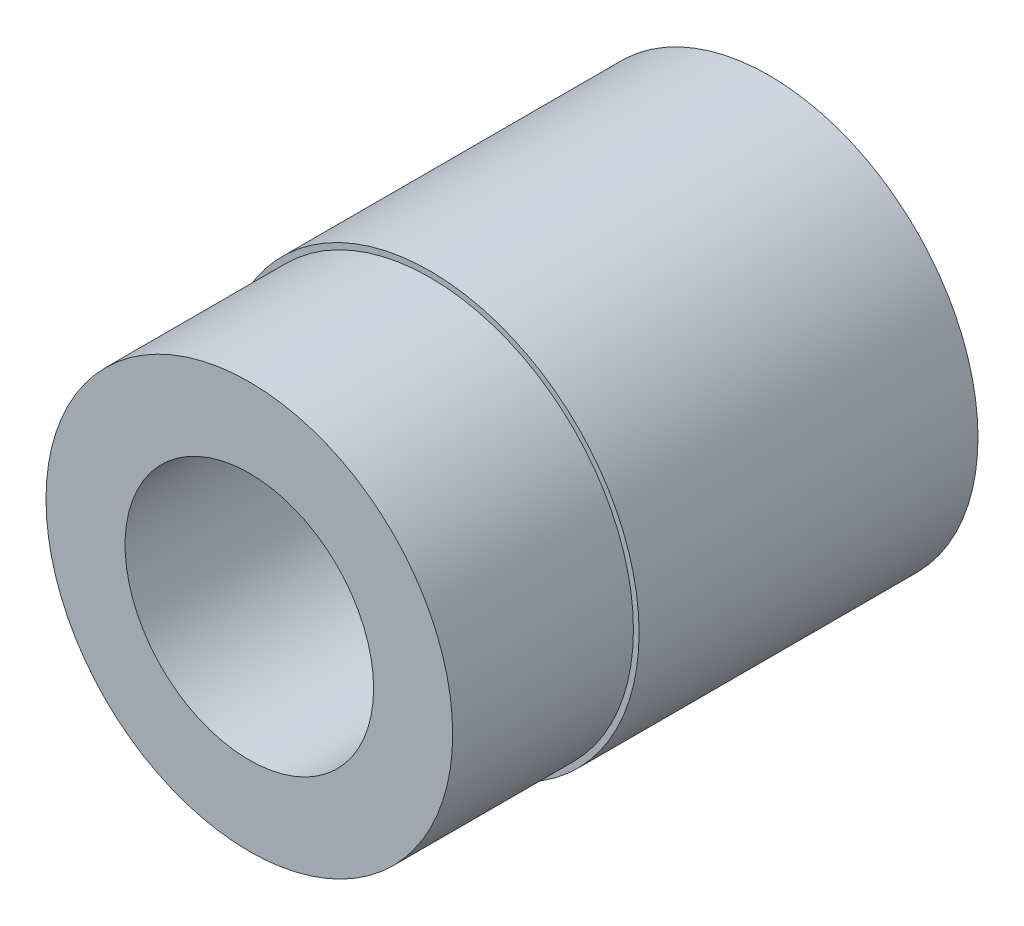
ISO-10303-21;
HEADER;
FILE_DESCRIPTION(('STEP AP214'),'2;1');
FILE_NAME('part.step','',(''),(''),'','','');
FILE_SCHEMA(('AUTOMOTIVE_DESIGN { 1 0 10303 214 1 1 1 1 }'));
ENDSEC;
DATA;
#1=APPLICATION_CONTEXT('core data for automotive mechanical design processes');
#2=APPLICATION_PROTOCOL_DEFINITION('international standard','automotive_design',2000,#1);
#3=PRODUCT_CONTEXT('',#1,'mechanical');
#4=PRODUCT('Part','Part','',(#3));
#5=PRODUCT_RELATED_PRODUCT_CATEGORY('part','',(#4));
#6=PRODUCT_DEFINITION_FORMATION('','',#4);
#7=PRODUCT_DEFINITION_CONTEXT('part definition',#1,'design');
#8=PRODUCT_DEFINITION('design','',#6,#7);
#9=PRODUCT_DEFINITION_SHAPE('','',#8);
#10=(LENGTH_UNIT() NAMED_UNIT(*) SI_UNIT(.MILLI.,.METRE.));
#11=(NAMED_UNIT(*) PLANE_ANGLE_UNIT() SI_UNIT($,.RADIAN.));
#12=(NAMED_UNIT(*) SI_UNIT($,.STERADIAN.) SOLID_ANGLE_UNIT());
#13=UNCERTAINTY_MEASURE_WITH_UNIT(LENGTH_MEASURE(1.E-05),#10,'distance_accuracy_value','');
#14=(GEOMETRIC_REPRESENTATION_CONTEXT(3) GLOBAL_UNCERTAINTY_ASSIGNED_CONTEXT((#13)) GLOBAL_UNIT_ASSIGNED_CONTEXT((#10,
#11,#12)) REPRESENTATION_CONTEXT('',''));
#15=CARTESIAN_POINT('',(0.,0.,0.));
#16=DIRECTION('',(0.,0.,1.));
#17=DIRECTION('',(1.,0.,0.));
#18=AXIS2_PLACEMENT_3D('',#15,#16,#17);
#19=CARTESIAN_POINT('',(0.,0.,30.));
#20=DIRECTION('',(0.,0.,1.));
#21=DIRECTION('',(1.,0.,0.));
#22=AXIS2_PLACEMENT_3D('',#19,#20,#21);
#23=PLANE('',#22);
#24=CARTESIAN_POINT('',(0.,0.,30.));
#25=DIRECTION('',(0.,0.,1.));
#26=DIRECTION('',(1.,0.,0.));
#27=AXIS2_PLACEMENT_3D('',#24,#25,#26);
#28=CIRCLE('',#27,18.5);
#29=CARTESIAN_POINT('',(18.5,0.,30.));
#30=VERTEX_POINT('',#29);
#31=EDGE_CURVE('E10',#30,#30,#28,.T.);
#32=ORIENTED_EDGE('',*,*,#31,.T.);
#33=EDGE_LOOP('',(#32));
#34=FACE_BOUND('',#33,.T.);
#35=CARTESIAN_POINT('',(0.,0.,30.));
#36=DIRECTION('',(0.,0.,1.));
#37=DIRECTION('',(1.,0.,0.));
#38=AXIS2_PLACEMENT_3D('',#35,#36,#37);
#39=CIRCLE('',#38,18.);
#40=CARTESIAN_POINT('',(18.,0.,30.));
#41=VERTEX_POINT('',#40);
#42=EDGE_CURVE('E41',#41,#41,#39,.T.);
#43=ORIENTED_EDGE('',*,*,#42,.F.);
#44=EDGE_LOOP('',(#43));
#45=FACE_BOUND('',#44,.T.);
#46=ADVANCED_FACE('F28',(#34,#45),#23,.T.);
#47=CARTESIAN_POINT('',(0.,0.,30.));
#48=DIRECTION('',(0.,0.,-1.));
#49=DIRECTION('',(-1.,0.,0.));
#50=AXIS2_PLACEMENT_3D('',#47,#48,#49);
#51=CYLINDRICAL_SURFACE('',#50,18.5);
#52=ORIENTED_EDGE('',*,*,#31,.F.);
#53=EDGE_LOOP('',(#52));
#54=FACE_BOUND('',#53,.T.);
#55=CARTESIAN_POINT('',(0.,0.,0.));
#56=DIRECTION('',(0.,0.,1.));
#57=DIRECTION('',(1.,0.,0.));
#58=AXIS2_PLACEMENT_3D('',#55,#56,#57);
#59=CIRCLE('',#58,18.5);
#60=CARTESIAN_POINT('',(18.5,0.,0.));
#61=VERTEX_POINT('',#60);
#62=EDGE_CURVE('E32',#61,#61,#59,.T.);
#63=ORIENTED_EDGE('',*,*,#62,.T.);
#64=EDGE_LOOP('',(#63));
#65=FACE_BOUND('',#64,.T.);
#66=ADVANCED_FACE('F30',(#54,#65),#51,.T.);
#67=CARTESIAN_POINT('',(0.,0.,0.));
#68=DIRECTION('',(0.,0.,1.));
#69=DIRECTION('',(1.,0.,0.));
#70=AXIS2_PLACEMENT_3D('',#67,#68,#69);
#71=PLANE('',#70);
#72=ORIENTED_EDGE('',*,*,#62,.F.);
#73=EDGE_LOOP('',(#72));
#74=FACE_BOUND('',#73,.T.);
#75=ADVANCED_FACE('F70',(#74),#71,.F.);
#76=CARTESIAN_POINT('',(0.,0.,46.));
#77=DIRECTION('',(0.,0.,-1.));
#78=DIRECTION('',(-1.,0.,0.));
#79=AXIS2_PLACEMENT_3D('',#76,#77,#78);
#80=CYLINDRICAL_SURFACE('',#79,18.);
#81=CARTESIAN_POINT('',(0.,0.,46.));
#82=DIRECTION('',(0.,0.,1.));
#83=DIRECTION('',(1.,0.,0.));
#84=AXIS2_PLACEMENT_3D('',#81,#82,#83);
#85=CIRCLE('',#84,18.);
#86=CARTESIAN_POINT('',(18.,0.,46.));
#87=VERTEX_POINT('',#86);
#88=EDGE_CURVE('E39',#87,#87,#85,.T.);
#89=ORIENTED_EDGE('',*,*,#88,.F.);
#90=EDGE_LOOP('',(#89));
#91=FACE_BOUND('',#90,.T.);
#92=ORIENTED_EDGE('',*,*,#42,.T.);
#93=EDGE_LOOP('',(#92));
#94=FACE_BOUND('',#93,.T.);
#95=ADVANCED_FACE('F64',(#91,#94),#80,.T.);
#96=CARTESIAN_POINT('',(0.,0.,46.));
#97=DIRECTION('',(0.,0.,1.));
#98=DIRECTION('',(1.,0.,0.));
#99=AXIS2_PLACEMENT_3D('',#96,#97,#98);
#100=PLANE('',#99);
#101=CARTESIAN_POINT('',(0.,0.,46.));
#102=DIRECTION('',(0.,0.,1.));
#103=DIRECTION('',(1.,0.,0.));
#104=AXIS2_PLACEMENT_3D('',#101,#102,#103);
#105=CIRCLE('',#104,11.);
#106=CARTESIAN_POINT('',(11.,0.,46.));
#107=VERTEX_POINT('',#106);
#108=EDGE_CURVE('E47',#107,#107,#105,.T.);
#109=ORIENTED_EDGE('',*,*,#108,.F.);
#110=EDGE_LOOP('',(#109));
#111=FACE_BOUND('',#110,.T.);
#112=ORIENTED_EDGE('',*,*,#88,.T.);
#113=EDGE_LOOP('',(#112));
#114=FACE_BOUND('',#113,.T.);
#115=ADVANCED_FACE('F58',(#111,#114),#100,.T.);
#116=CARTESIAN_POINT('',(0.,0.,16.));
#117=DIRECTION('',(0.,0.,1.));
#118=DIRECTION('',(1.,0.,0.));
#119=AXIS2_PLACEMENT_3D('',#116,#117,#118);
#120=CYLINDRICAL_SURFACE('',#119,11.);
#121=CARTESIAN_POINT('',(0.,0.,16.));
#122=DIRECTION('',(0.,0.,1.));
#123=DIRECTION('',(1.,0.,0.));
#124=AXIS2_PLACEMENT_3D('',#121,#122,#123);
#125=CIRCLE('',#124,11.);
#126=CARTESIAN_POINT('',(11.,0.,16.));
#127=VERTEX_POINT('',#126);
#128=EDGE_CURVE('E44',#127,#127,#125,.T.);
#129=ORIENTED_EDGE('',*,*,#128,.F.);
#130=EDGE_LOOP('',(#129));
#131=FACE_BOUND('',#130,.T.);
#132=ORIENTED_EDGE('',*,*,#108,.T.);
#133=EDGE_LOOP('',(#132));
#134=FACE_BOUND('',#133,.T.);
#135=ADVANCED_FACE('F55',(#131,#134),#120,.F.);
#136=CARTESIAN_POINT('',(0.,0.,16.));
#137=DIRECTION('',(0.,0.,1.));
#138=DIRECTION('',(1.,0.,0.));
#139=AXIS2_PLACEMENT_3D('',#136,#137,#138);
#140=PLANE('',#139);
#141=ORIENTED_EDGE('',*,*,#128,.T.);
#142=EDGE_LOOP('',(#141));
#143=FACE_BOUND('',#142,.T.);
#144=ADVANCED_FACE('F53',(#143),#140,.T.);
#145=CLOSED_SHELL('',(#46,#66,#75,#95,#115,#135,#144));
#146=MANIFOLD_SOLID_BREP('B2',#145);
#147=ADVANCED_BREP_SHAPE_REPRESENTATION('',(#18,#146),#14);
#148=SHAPE_DEFINITION_REPRESENTATION(#9,#147);
ENDSEC;
END-ISO-10303-21;
